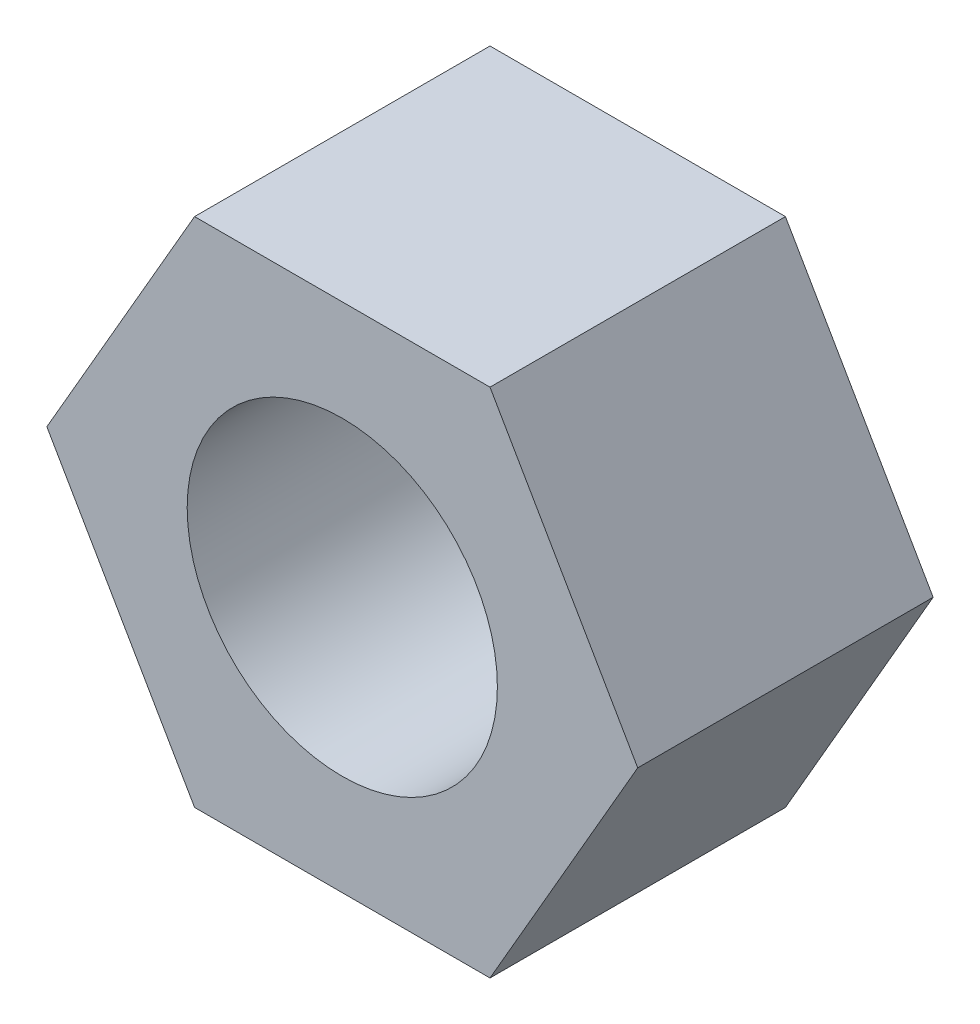
ISO-10303-21;
HEADER;
FILE_DESCRIPTION(('STEP AP214'),'2;1');
FILE_NAME('part.step','',(''),(''),'','','');
FILE_SCHEMA(('AUTOMOTIVE_DESIGN { 1 0 10303 214 1 1 1 1 }'));
ENDSEC;
DATA;
#1=APPLICATION_CONTEXT('core data for automotive mechanical design processes');
#2=APPLICATION_PROTOCOL_DEFINITION('international standard','automotive_design',2000,#1);
#3=PRODUCT_CONTEXT('',#1,'mechanical');
#4=PRODUCT('Part','Part','',(#3));
#5=PRODUCT_RELATED_PRODUCT_CATEGORY('part','',(#4));
#6=PRODUCT_DEFINITION_FORMATION('','',#4);
#7=PRODUCT_DEFINITION_CONTEXT('part definition',#1,'design');
#8=PRODUCT_DEFINITION('design','',#6,#7);
#9=PRODUCT_DEFINITION_SHAPE('','',#8);
#10=(LENGTH_UNIT() NAMED_UNIT(*) SI_UNIT(.MILLI.,.METRE.));
#11=(NAMED_UNIT(*) PLANE_ANGLE_UNIT() SI_UNIT($,.RADIAN.));
#12=(NAMED_UNIT(*) SI_UNIT($,.STERADIAN.) SOLID_ANGLE_UNIT());
#13=UNCERTAINTY_MEASURE_WITH_UNIT(LENGTH_MEASURE(1.E-05),#10,'distance_accuracy_value','');
#14=(GEOMETRIC_REPRESENTATION_CONTEXT(3) GLOBAL_UNCERTAINTY_ASSIGNED_CONTEXT((#13)) GLOBAL_UNIT_ASSIGNED_CONTEXT((#10,
#11,#12)) REPRESENTATION_CONTEXT('',''));
#15=CARTESIAN_POINT('',(0.,0.,0.));
#16=DIRECTION('',(0.,0.,1.));
#17=DIRECTION('',(1.,0.,0.));
#18=AXIS2_PLACEMENT_3D('',#15,#16,#17);
#19=CARTESIAN_POINT('',(-2.,-3.46410161513775,4.));
#20=DIRECTION('',(0.,1.,0.));
#21=DIRECTION('',(0.,0.,1.));
#22=AXIS2_PLACEMENT_3D('',#19,#20,#21);
#23=PLANE('',#22);
#24=DIRECTION('',(1.,0.,0.));
#25=VECTOR('',#24,1.);
#26=CARTESIAN_POINT('',(-2.,-3.46410161513775,0.));
#27=LINE('',#26,#25);
#28=CARTESIAN_POINT('',(-2.,-3.46410161513775,0.));
#29=VERTEX_POINT('',#28);
#30=CARTESIAN_POINT('',(2.,-3.46410161513775,0.));
#31=VERTEX_POINT('',#30);
#32=EDGE_CURVE('E104',#29,#31,#27,.T.);
#33=ORIENTED_EDGE('',*,*,#32,.T.);
#34=DIRECTION('',(0.,0.,-1.));
#35=VECTOR('',#34,1.);
#36=CARTESIAN_POINT('',(2.,-3.46410161513775,4.));
#37=LINE('',#36,#35);
#38=CARTESIAN_POINT('',(2.,-3.46410161513775,4.));
#39=VERTEX_POINT('',#38);
#40=EDGE_CURVE('E11',#39,#31,#37,.T.);
#41=ORIENTED_EDGE('',*,*,#40,.F.);
#42=DIRECTION('',(1.,0.,0.));
#43=VECTOR('',#42,1.);
#44=CARTESIAN_POINT('',(-2.,-3.46410161513775,4.));
#45=LINE('',#44,#43);
#46=CARTESIAN_POINT('',(-2.,-3.46410161513775,4.));
#47=VERTEX_POINT('',#46);
#48=EDGE_CURVE('E140',#47,#39,#45,.T.);
#49=ORIENTED_EDGE('',*,*,#48,.F.);
#50=DIRECTION('',(0.,0.,-1.));
#51=VECTOR('',#50,1.);
#52=CARTESIAN_POINT('',(-2.,-3.46410161513775,4.));
#53=LINE('',#52,#51);
#54=EDGE_CURVE('E118',#47,#29,#53,.T.);
#55=ORIENTED_EDGE('',*,*,#54,.T.);
#56=EDGE_LOOP('',(#33,#41,#49,#55));
#57=FACE_BOUND('',#56,.T.);
#58=ADVANCED_FACE('F47',(#57),#23,.F.);
#59=CARTESIAN_POINT('',(2.,-3.46410161513775,4.));
#60=DIRECTION('',(-0.866025403784439,0.5,0.));
#61=DIRECTION('',(-0.5,-0.866025403784439,0.));
#62=AXIS2_PLACEMENT_3D('',#59,#60,#61);
#63=PLANE('',#62);
#64=DIRECTION('',(0.5,0.866025403784439,0.));
#65=VECTOR('',#64,1.);
#66=CARTESIAN_POINT('',(2.,-3.46410161513775,0.));
#67=LINE('',#66,#65);
#68=CARTESIAN_POINT('',(4.,0.,0.));
#69=VERTEX_POINT('',#68);
#70=EDGE_CURVE('E100',#31,#69,#67,.T.);
#71=ORIENTED_EDGE('',*,*,#70,.T.);
#72=DIRECTION('',(0.,0.,-1.));
#73=VECTOR('',#72,1.);
#74=CARTESIAN_POINT('',(4.,0.,4.));
#75=LINE('',#74,#73);
#76=CARTESIAN_POINT('',(4.,0.,4.));
#77=VERTEX_POINT('',#76);
#78=EDGE_CURVE('E55',#77,#69,#75,.T.);
#79=ORIENTED_EDGE('',*,*,#78,.F.);
#80=DIRECTION('',(0.5,0.866025403784439,0.));
#81=VECTOR('',#80,1.);
#82=CARTESIAN_POINT('',(2.,-3.46410161513775,4.));
#83=LINE('',#82,#81);
#84=EDGE_CURVE('E114',#39,#77,#83,.T.);
#85=ORIENTED_EDGE('',*,*,#84,.F.);
#86=ORIENTED_EDGE('',*,*,#40,.T.);
#87=EDGE_LOOP('',(#71,#79,#85,#86));
#88=FACE_BOUND('',#87,.T.);
#89=ADVANCED_FACE('F113',(#88),#63,.F.);
#90=CARTESIAN_POINT('',(4.,0.,4.));
#91=DIRECTION('',(-0.866025403784439,-0.5,0.));
#92=DIRECTION('',(0.5,-0.866025403784439,0.));
#93=AXIS2_PLACEMENT_3D('',#90,#91,#92);
#94=PLANE('',#93);
#95=DIRECTION('',(-0.5,0.866025403784439,0.));
#96=VECTOR('',#95,1.);
#97=CARTESIAN_POINT('',(4.,0.,0.));
#98=LINE('',#97,#96);
#99=CARTESIAN_POINT('',(2.,3.46410161513775,0.));
#100=VERTEX_POINT('',#99);
#101=EDGE_CURVE('E106',#69,#100,#98,.T.);
#102=ORIENTED_EDGE('',*,*,#101,.T.);
#103=DIRECTION('',(0.,0.,-1.));
#104=VECTOR('',#103,1.);
#105=CARTESIAN_POINT('',(2.,3.46410161513775,4.));
#106=LINE('',#105,#104);
#107=CARTESIAN_POINT('',(2.,3.46410161513775,4.));
#108=VERTEX_POINT('',#107);
#109=EDGE_CURVE('E165',#108,#100,#106,.T.);
#110=ORIENTED_EDGE('',*,*,#109,.F.);
#111=DIRECTION('',(-0.5,0.866025403784439,0.));
#112=VECTOR('',#111,1.);
#113=CARTESIAN_POINT('',(4.,0.,4.));
#114=LINE('',#113,#112);
#115=EDGE_CURVE('E145',#77,#108,#114,.T.);
#116=ORIENTED_EDGE('',*,*,#115,.F.);
#117=ORIENTED_EDGE('',*,*,#78,.T.);
#118=EDGE_LOOP('',(#102,#110,#116,#117));
#119=FACE_BOUND('',#118,.T.);
#120=ADVANCED_FACE('F172',(#119),#94,.F.);
#121=CARTESIAN_POINT('',(2.,3.46410161513775,4.));
#122=DIRECTION('',(0.,-1.,0.));
#123=DIRECTION('',(0.,0.,-1.));
#124=AXIS2_PLACEMENT_3D('',#121,#122,#123);
#125=PLANE('',#124);
#126=DIRECTION('',(-1.,0.,0.));
#127=VECTOR('',#126,1.);
#128=CARTESIAN_POINT('',(2.,3.46410161513775,0.));
#129=LINE('',#128,#127);
#130=CARTESIAN_POINT('',(-2.,3.46410161513775,0.));
#131=VERTEX_POINT('',#130);
#132=EDGE_CURVE('E131',#100,#131,#129,.T.);
#133=ORIENTED_EDGE('',*,*,#132,.T.);
#134=DIRECTION('',(0.,0.,-1.));
#135=VECTOR('',#134,1.);
#136=CARTESIAN_POINT('',(-2.,3.46410161513775,4.));
#137=LINE('',#136,#135);
#138=CARTESIAN_POINT('',(-2.,3.46410161513775,4.));
#139=VERTEX_POINT('',#138);
#140=EDGE_CURVE('E161',#139,#131,#137,.T.);
#141=ORIENTED_EDGE('',*,*,#140,.F.);
#142=DIRECTION('',(-1.,0.,0.));
#143=VECTOR('',#142,1.);
#144=CARTESIAN_POINT('',(2.,3.46410161513775,4.));
#145=LINE('',#144,#143);
#146=EDGE_CURVE('E148',#108,#139,#145,.T.);
#147=ORIENTED_EDGE('',*,*,#146,.F.);
#148=ORIENTED_EDGE('',*,*,#109,.T.);
#149=EDGE_LOOP('',(#133,#141,#147,#148));
#150=FACE_BOUND('',#149,.T.);
#151=ADVANCED_FACE('F178',(#150),#125,.F.);
#152=CARTESIAN_POINT('',(-2.,3.46410161513775,4.));
#153=DIRECTION('',(0.866025403784438,-0.5,0.));
#154=DIRECTION('',(0.5,0.866025403784439,0.));
#155=AXIS2_PLACEMENT_3D('',#152,#153,#154);
#156=PLANE('',#155);
#157=DIRECTION('',(-0.5,-0.866025403784438,0.));
#158=VECTOR('',#157,1.);
#159=CARTESIAN_POINT('',(-2.,3.46410161513775,0.));
#160=LINE('',#159,#158);
#161=CARTESIAN_POINT('',(-4.,0.,0.));
#162=VERTEX_POINT('',#161);
#163=EDGE_CURVE('E134',#131,#162,#160,.T.);
#164=ORIENTED_EDGE('',*,*,#163,.T.);
#165=DIRECTION('',(0.,0.,-1.));
#166=VECTOR('',#165,1.);
#167=CARTESIAN_POINT('',(-4.,0.,4.));
#168=LINE('',#167,#166);
#169=CARTESIAN_POINT('',(-4.,0.,4.));
#170=VERTEX_POINT('',#169);
#171=EDGE_CURVE('E157',#170,#162,#168,.T.);
#172=ORIENTED_EDGE('',*,*,#171,.F.);
#173=DIRECTION('',(-0.5,-0.866025403784438,0.));
#174=VECTOR('',#173,1.);
#175=CARTESIAN_POINT('',(-2.,3.46410161513775,4.));
#176=LINE('',#175,#174);
#177=EDGE_CURVE('E67',#139,#170,#176,.T.);
#178=ORIENTED_EDGE('',*,*,#177,.F.);
#179=ORIENTED_EDGE('',*,*,#140,.T.);
#180=EDGE_LOOP('',(#164,#172,#178,#179));
#181=FACE_BOUND('',#180,.T.);
#182=ADVANCED_FACE('F181',(#181),#156,.F.);
#183=CARTESIAN_POINT('',(-4.,0.,4.));
#184=DIRECTION('',(0.866025403784439,0.5,0.));
#185=DIRECTION('',(-0.5,0.866025403784439,0.));
#186=AXIS2_PLACEMENT_3D('',#183,#184,#185);
#187=PLANE('',#186);
#188=DIRECTION('',(0.5,-0.866025403784439,0.));
#189=VECTOR('',#188,1.);
#190=CARTESIAN_POINT('',(-4.,0.,0.));
#191=LINE('',#190,#189);
#192=EDGE_CURVE('E137',#162,#29,#191,.T.);
#193=ORIENTED_EDGE('',*,*,#192,.T.);
#194=ORIENTED_EDGE('',*,*,#54,.F.);
#195=DIRECTION('',(0.5,-0.866025403784439,0.));
#196=VECTOR('',#195,1.);
#197=CARTESIAN_POINT('',(-4.,0.,4.));
#198=LINE('',#197,#196);
#199=EDGE_CURVE('E62',#170,#47,#198,.T.);
#200=ORIENTED_EDGE('',*,*,#199,.F.);
#201=ORIENTED_EDGE('',*,*,#171,.T.);
#202=EDGE_LOOP('',(#193,#194,#200,#201));
#203=FACE_BOUND('',#202,.T.);
#204=ADVANCED_FACE('F183',(#203),#187,.F.);
#205=CARTESIAN_POINT('',(-2.,-3.46410161513775,4.));
#206=DIRECTION('',(0.,0.,-1.));
#207=DIRECTION('',(-1.,0.,0.));
#208=AXIS2_PLACEMENT_3D('',#205,#206,#207);
#209=PLANE('',#208);
#210=CARTESIAN_POINT('',(0.,0.,4.));
#211=DIRECTION('',(0.,0.,-1.));
#212=DIRECTION('',(-1.,0.,0.));
#213=AXIS2_PLACEMENT_3D('',#210,#211,#212);
#214=CIRCLE('',#213,2.1);
#215=CARTESIAN_POINT('',(-2.1,0.,4.));
#216=VERTEX_POINT('',#215);
#217=EDGE_CURVE('E120',#216,#216,#214,.T.);
#218=ORIENTED_EDGE('',*,*,#217,.T.);
#219=EDGE_LOOP('',(#218));
#220=FACE_BOUND('',#219,.T.);
#221=ORIENTED_EDGE('',*,*,#48,.T.);
#222=ORIENTED_EDGE('',*,*,#84,.T.);
#223=ORIENTED_EDGE('',*,*,#115,.T.);
#224=ORIENTED_EDGE('',*,*,#146,.T.);
#225=ORIENTED_EDGE('',*,*,#177,.T.);
#226=ORIENTED_EDGE('',*,*,#199,.T.);
#227=EDGE_LOOP('',(#221,#222,#223,#224,#225,#226));
#228=FACE_BOUND('',#227,.T.);
#229=ADVANCED_FACE('F175',(#220,#228),#209,.F.);
#230=CARTESIAN_POINT('',(-2.,-3.46410161513775,0.));
#231=DIRECTION('',(0.,0.,-1.));
#232=DIRECTION('',(-1.,0.,0.));
#233=AXIS2_PLACEMENT_3D('',#230,#231,#232);
#234=PLANE('',#233);
#235=CARTESIAN_POINT('',(0.,0.,0.));
#236=DIRECTION('',(0.,0.,-1.));
#237=DIRECTION('',(-1.,0.,0.));
#238=AXIS2_PLACEMENT_3D('',#235,#236,#237);
#239=CIRCLE('',#238,2.09999999999999);
#240=CARTESIAN_POINT('',(-2.09999999999999,0.,0.));
#241=VERTEX_POINT('',#240);
#242=EDGE_CURVE('E125',#241,#241,#239,.T.);
#243=ORIENTED_EDGE('',*,*,#242,.F.);
#244=EDGE_LOOP('',(#243));
#245=FACE_BOUND('',#244,.T.);
#246=ORIENTED_EDGE('',*,*,#32,.F.);
#247=ORIENTED_EDGE('',*,*,#192,.F.);
#248=ORIENTED_EDGE('',*,*,#163,.F.);
#249=ORIENTED_EDGE('',*,*,#132,.F.);
#250=ORIENTED_EDGE('',*,*,#101,.F.);
#251=ORIENTED_EDGE('',*,*,#70,.F.);
#252=EDGE_LOOP('',(#246,#247,#248,#249,#250,#251));
#253=FACE_BOUND('',#252,.T.);
#254=ADVANCED_FACE('F101',(#245,#253),#234,.T.);
#255=CARTESIAN_POINT('',(0.,0.,0.));
#256=DIRECTION('',(0.,0.,-1.));
#257=DIRECTION('',(-1.,0.,0.));
#258=AXIS2_PLACEMENT_3D('',#255,#256,#257);
#259=CYLINDRICAL_SURFACE('',#258,2.09999999999999);
#260=ORIENTED_EDGE('',*,*,#217,.F.);
#261=EDGE_LOOP('',(#260));
#262=FACE_BOUND('',#261,.T.);
#263=ORIENTED_EDGE('',*,*,#242,.T.);
#264=EDGE_LOOP('',(#263));
#265=FACE_BOUND('',#264,.T.);
#266=ADVANCED_FACE('F230',(#262,#265),#259,.F.);
#267=CLOSED_SHELL('',(#58,#89,#120,#151,#182,#204,#229,#254,#266));
#268=MANIFOLD_SOLID_BREP('B2',#267);
#269=ADVANCED_BREP_SHAPE_REPRESENTATION('',(#18,#268),#14);
#270=SHAPE_DEFINITION_REPRESENTATION(#9,#269);
ENDSEC;
END-ISO-10303-21;
